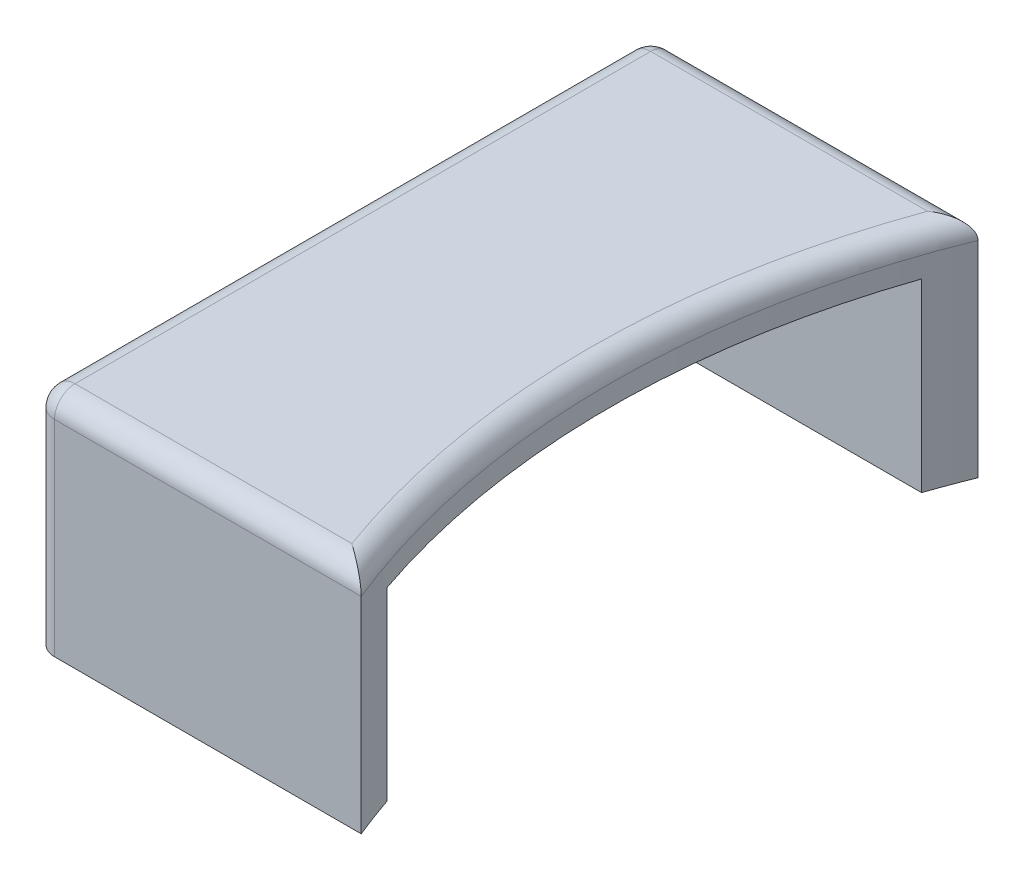
ISO-10303-21;
HEADER;
FILE_DESCRIPTION(('STEP AP214'),'2;1');
FILE_NAME('part.step','',(''),(''),'','','');
FILE_SCHEMA(('AUTOMOTIVE_DESIGN { 1 0 10303 214 1 1 1 1 }'));
ENDSEC;
DATA;
#1=APPLICATION_CONTEXT('core data for automotive mechanical design processes');
#2=APPLICATION_PROTOCOL_DEFINITION('international standard','automotive_design',2000,#1);
#3=PRODUCT_CONTEXT('',#1,'mechanical');
#4=PRODUCT('Part','Part','',(#3));
#5=PRODUCT_RELATED_PRODUCT_CATEGORY('part','',(#4));
#6=PRODUCT_DEFINITION_FORMATION('','',#4);
#7=PRODUCT_DEFINITION_CONTEXT('part definition',#1,'design');
#8=PRODUCT_DEFINITION('design','',#6,#7);
#9=PRODUCT_DEFINITION_SHAPE('','',#8);
#10=(LENGTH_UNIT() NAMED_UNIT(*) SI_UNIT(.MILLI.,.METRE.));
#11=(NAMED_UNIT(*) PLANE_ANGLE_UNIT() SI_UNIT($,.RADIAN.));
#12=(NAMED_UNIT(*) SI_UNIT($,.STERADIAN.) SOLID_ANGLE_UNIT());
#13=UNCERTAINTY_MEASURE_WITH_UNIT(LENGTH_MEASURE(1.E-05),#10,'distance_accuracy_value','');
#14=(GEOMETRIC_REPRESENTATION_CONTEXT(3) GLOBAL_UNCERTAINTY_ASSIGNED_CONTEXT((#13)) GLOBAL_UNIT_ASSIGNED_CONTEXT((#10,
#11,#12)) REPRESENTATION_CONTEXT('',''));
#15=CARTESIAN_POINT('',(0.,0.,0.));
#16=DIRECTION('',(0.,0.,1.));
#17=DIRECTION('',(1.,0.,0.));
#18=AXIS2_PLACEMENT_3D('',#15,#16,#17);
#19=CARTESIAN_POINT('',(0.,11.,0.));
#20=DIRECTION('',(0.,0.,-1.));
#21=DIRECTION('',(-1.,0.,0.));
#22=AXIS2_PLACEMENT_3D('',#19,#20,#21);
#23=PLANE('',#22);
#24=DIRECTION('',(1.,0.,0.));
#25=VECTOR('',#24,1.);
#26=CARTESIAN_POINT('',(0.,10.,0.));
#27=LINE('',#26,#25);
#28=CARTESIAN_POINT('',(15.92,10.,0.));
#29=VERTEX_POINT('',#28);
#30=CARTESIAN_POINT('',(1.,10.,0.));
#31=VERTEX_POINT('',#30);
#32=EDGE_CURVE('E193',#29,#31,#27,.F.);
#33=ORIENTED_EDGE('',*,*,#32,.T.);
#34=DIRECTION('',(0.,-1.,0.));
#35=VECTOR('',#34,1.);
#36=CARTESIAN_POINT('',(1.,11.,0.));
#37=LINE('',#36,#35);
#38=CARTESIAN_POINT('',(1.,0.,0.));
#39=VERTEX_POINT('',#38);
#40=EDGE_CURVE('E195',#31,#39,#37,.T.);
#41=ORIENTED_EDGE('',*,*,#40,.T.);
#42=DIRECTION('',(1.,0.,0.));
#43=VECTOR('',#42,1.);
#44=CARTESIAN_POINT('',(0.,0.,0.));
#45=LINE('',#44,#43);
#46=CARTESIAN_POINT('',(15.92,0.,0.));
#47=VERTEX_POINT('',#46);
#48=EDGE_CURVE('E165',#39,#47,#45,.T.);
#49=ORIENTED_EDGE('',*,*,#48,.T.);
#50=DIRECTION('',(0.,-1.,0.));
#51=VECTOR('',#50,1.);
#52=CARTESIAN_POINT('',(15.92,11.,0.));
#53=LINE('',#52,#51);
#54=EDGE_CURVE('E178',#29,#47,#53,.T.);
#55=ORIENTED_EDGE('',*,*,#54,.F.);
#56=EDGE_LOOP('',(#33,#41,#49,#55));
#57=FACE_BOUND('',#56,.T.);
#58=ADVANCED_FACE('F35',(#57),#23,.F.);
#59=CARTESIAN_POINT('',(53.,11.,-15.));
#60=DIRECTION('',(0.,-1.,0.));
#61=DIRECTION('',(0.,0.,-1.));
#62=AXIS2_PLACEMENT_3D('',#59,#60,#61);
#63=CYLINDRICAL_SURFACE('',#62,39.9990799894198);
#64=DIRECTION('',(0.,-1.,0.));
#65=VECTOR('',#64,1.);
#66=CARTESIAN_POINT('',(15.92,11.,-30.));
#67=LINE('',#66,#65);
#68=CARTESIAN_POINT('',(15.92,10.,-30.));
#69=VERTEX_POINT('',#68);
#70=CARTESIAN_POINT('',(15.92,0.,-30.));
#71=VERTEX_POINT('',#70);
#72=EDGE_CURVE('E176',#69,#71,#67,.T.);
#73=ORIENTED_EDGE('',*,*,#72,.F.);
#74=CARTESIAN_POINT('',(53.,10.,-15.));
#75=DIRECTION('',(0.,1.,0.));
#76=DIRECTION('',(0.,0.,1.));
#77=AXIS2_PLACEMENT_3D('',#74,#75,#76);
#78=CIRCLE('',#77,39.9990799894198);
#79=EDGE_CURVE('E190',#69,#29,#78,.T.);
#80=ORIENTED_EDGE('',*,*,#79,.T.);
#81=ORIENTED_EDGE('',*,*,#54,.T.);
#82=CARTESIAN_POINT('',(53.,0.,-15.));
#83=DIRECTION('',(0.,-1.,0.));
#84=DIRECTION('',(0.,0.,1.));
#85=AXIS2_PLACEMENT_3D('',#82,#83,#84);
#86=CIRCLE('',#85,39.9990799894198);
#87=CARTESIAN_POINT('',(15.1724121836985,0.,-2.));
#88=VERTEX_POINT('',#87);
#89=EDGE_CURVE('E168',#47,#88,#86,.T.);
#90=ORIENTED_EDGE('',*,*,#89,.T.);
#91=DIRECTION('',(0.,-1.,0.));
#92=VECTOR('',#91,1.);
#93=CARTESIAN_POINT('',(15.1724121836985,9.,-2.));
#94=LINE('',#93,#92);
#95=CARTESIAN_POINT('',(15.1724121836985,9.,-2.));
#96=VERTEX_POINT('',#95);
#97=EDGE_CURVE('E162',#96,#88,#94,.T.);
#98=ORIENTED_EDGE('',*,*,#97,.F.);
#99=CARTESIAN_POINT('',(53.,9.,-15.));
#100=DIRECTION('',(0.,1.,0.));
#101=DIRECTION('',(0.,0.,1.));
#102=AXIS2_PLACEMENT_3D('',#99,#100,#101);
#103=CIRCLE('',#102,39.9990799894198);
#104=CARTESIAN_POINT('',(15.1724121836985,9.,-28.));
#105=VERTEX_POINT('',#104);
#106=EDGE_CURVE('E148',#96,#105,#103,.F.);
#107=ORIENTED_EDGE('',*,*,#106,.T.);
#108=DIRECTION('',(0.,-1.,0.));
#109=VECTOR('',#108,1.);
#110=CARTESIAN_POINT('',(15.1724121836985,9.,-28.));
#111=LINE('',#110,#109);
#112=CARTESIAN_POINT('',(15.1724121836985,0.,-28.));
#113=VERTEX_POINT('',#112);
#114=EDGE_CURVE('E156',#105,#113,#111,.T.);
#115=ORIENTED_EDGE('',*,*,#114,.T.);
#116=EDGE_CURVE('E167',#113,#71,#86,.T.);
#117=ORIENTED_EDGE('',*,*,#116,.T.);
#118=EDGE_LOOP('',(#73,#80,#81,#90,#98,#107,#115,#117));
#119=FACE_BOUND('',#118,.T.);
#120=ADVANCED_FACE('F254',(#119),#63,.F.);
#121=CARTESIAN_POINT('',(15.92,11.,-30.));
#122=DIRECTION('',(0.,0.,1.));
#123=DIRECTION('',(1.,0.,0.));
#124=AXIS2_PLACEMENT_3D('',#121,#122,#123);
#125=PLANE('',#124);
#126=DIRECTION('',(-1.,0.,0.));
#127=VECTOR('',#126,1.);
#128=CARTESIAN_POINT('',(15.92,0.,-30.));
#129=LINE('',#128,#127);
#130=CARTESIAN_POINT('',(1.,0.,-30.));
#131=VERTEX_POINT('',#130);
#132=EDGE_CURVE('E171',#71,#131,#129,.T.);
#133=ORIENTED_EDGE('',*,*,#132,.T.);
#134=DIRECTION('',(0.,-1.,0.));
#135=VECTOR('',#134,1.);
#136=CARTESIAN_POINT('',(1.,11.,-30.));
#137=LINE('',#136,#135);
#138=CARTESIAN_POINT('',(1.,10.,-30.));
#139=VERTEX_POINT('',#138);
#140=EDGE_CURVE('E11',#131,#139,#137,.F.);
#141=ORIENTED_EDGE('',*,*,#140,.T.);
#142=DIRECTION('',(-1.,0.,0.));
#143=VECTOR('',#142,1.);
#144=CARTESIAN_POINT('',(15.92,10.,-30.));
#145=LINE('',#144,#143);
#146=EDGE_CURVE('E44',#139,#69,#145,.F.);
#147=ORIENTED_EDGE('',*,*,#146,.T.);
#148=ORIENTED_EDGE('',*,*,#72,.T.);
#149=EDGE_LOOP('',(#133,#141,#147,#148));
#150=FACE_BOUND('',#149,.T.);
#151=ADVANCED_FACE('F259',(#150),#125,.F.);
#152=CARTESIAN_POINT('',(0.,11.,0.));
#153=DIRECTION('',(1.,0.,0.));
#154=DIRECTION('',(0.,0.,-1.));
#155=AXIS2_PLACEMENT_3D('',#152,#153,#154);
#156=PLANE('',#155);
#157=DIRECTION('',(0.,0.,1.));
#158=VECTOR('',#157,1.);
#159=CARTESIAN_POINT('',(0.,0.,0.));
#160=LINE('',#159,#158);
#161=CARTESIAN_POINT('',(0.,0.,-29.));
#162=VERTEX_POINT('',#161);
#163=CARTESIAN_POINT('',(0.,0.,-1.));
#164=VERTEX_POINT('',#163);
#165=EDGE_CURVE('E173',#162,#164,#160,.T.);
#166=ORIENTED_EDGE('',*,*,#165,.T.);
#167=DIRECTION('',(0.,-1.,0.));
#168=VECTOR('',#167,1.);
#169=CARTESIAN_POINT('',(0.,11.,-1.));
#170=LINE('',#169,#168);
#171=CARTESIAN_POINT('',(0.,10.,-1.));
#172=VERTEX_POINT('',#171);
#173=EDGE_CURVE('E204',#164,#172,#170,.F.);
#174=ORIENTED_EDGE('',*,*,#173,.T.);
#175=DIRECTION('',(0.,0.,1.));
#176=VECTOR('',#175,1.);
#177=CARTESIAN_POINT('',(0.,10.,-30.));
#178=LINE('',#177,#176);
#179=CARTESIAN_POINT('',(0.,10.,-29.));
#180=VERTEX_POINT('',#179);
#181=EDGE_CURVE('E58',#172,#180,#178,.F.);
#182=ORIENTED_EDGE('',*,*,#181,.T.);
#183=DIRECTION('',(0.,-1.,0.));
#184=VECTOR('',#183,1.);
#185=CARTESIAN_POINT('',(0.,11.,-29.));
#186=LINE('',#185,#184);
#187=EDGE_CURVE('E202',#180,#162,#186,.T.);
#188=ORIENTED_EDGE('',*,*,#187,.T.);
#189=EDGE_LOOP('',(#166,#174,#182,#188));
#190=FACE_BOUND('',#189,.T.);
#191=ADVANCED_FACE('F265',(#190),#156,.F.);
#192=CARTESIAN_POINT('',(53.,11.,-15.));
#193=DIRECTION('',(0.,1.,0.));
#194=DIRECTION('',(0.,0.,1.));
#195=AXIS2_PLACEMENT_3D('',#192,#193,#194);
#196=PLANE('',#195);
#197=DIRECTION('',(0.,0.,1.));
#198=VECTOR('',#197,1.);
#199=CARTESIAN_POINT('',(1.,11.,0.));
#200=LINE('',#199,#198);
#201=CARTESIAN_POINT('',(1.,11.,-29.));
#202=VERTEX_POINT('',#201);
#203=CARTESIAN_POINT('',(1.,11.,-1.));
#204=VERTEX_POINT('',#203);
#205=EDGE_CURVE('E183',#202,#204,#200,.T.);
#206=ORIENTED_EDGE('',*,*,#205,.T.);
#207=DIRECTION('',(1.,0.,0.));
#208=VECTOR('',#207,1.);
#209=CARTESIAN_POINT('',(15.92,11.,-1.));
#210=LINE('',#209,#208);
#211=CARTESIAN_POINT('',(14.4652811093835,11.,-1.));
#212=VERTEX_POINT('',#211);
#213=EDGE_CURVE('E188',#204,#212,#210,.T.);
#214=ORIENTED_EDGE('',*,*,#213,.T.);
#215=CARTESIAN_POINT('',(53.,11.,-15.));
#216=DIRECTION('',(0.,1.,0.));
#217=DIRECTION('',(0.,0.,1.));
#218=AXIS2_PLACEMENT_3D('',#215,#216,#217);
#219=CIRCLE('',#218,40.9990799894198);
#220=CARTESIAN_POINT('',(14.4652811093835,11.,-29.));
#221=VERTEX_POINT('',#220);
#222=EDGE_CURVE('E185',#212,#221,#219,.F.);
#223=ORIENTED_EDGE('',*,*,#222,.T.);
#224=DIRECTION('',(-1.,0.,0.));
#225=VECTOR('',#224,1.);
#226=CARTESIAN_POINT('',(0.,11.,-29.));
#227=LINE('',#226,#225);
#228=EDGE_CURVE('E181',#221,#202,#227,.T.);
#229=ORIENTED_EDGE('',*,*,#228,.T.);
#230=EDGE_LOOP('',(#206,#214,#223,#229));
#231=FACE_BOUND('',#230,.T.);
#232=ADVANCED_FACE('F268',(#231),#196,.T.);
#233=CARTESIAN_POINT('',(53.,0.,-15.));
#234=DIRECTION('',(0.,1.,0.));
#235=DIRECTION('',(0.,0.,1.));
#236=AXIS2_PLACEMENT_3D('',#233,#234,#235);
#237=PLANE('',#236);
#238=ORIENTED_EDGE('',*,*,#48,.F.);
#239=CARTESIAN_POINT('',(1.,0.,-1.));
#240=DIRECTION('',(0.,1.,0.));
#241=DIRECTION('',(0.,0.,1.));
#242=AXIS2_PLACEMENT_3D('',#239,#240,#241);
#243=CIRCLE('',#242,1.);
#244=EDGE_CURVE('E199',#39,#164,#243,.F.);
#245=ORIENTED_EDGE('',*,*,#244,.T.);
#246=ORIENTED_EDGE('',*,*,#165,.F.);
#247=CARTESIAN_POINT('',(1.,0.,-29.));
#248=DIRECTION('',(0.,1.,0.));
#249=DIRECTION('',(0.,0.,1.));
#250=AXIS2_PLACEMENT_3D('',#247,#248,#249);
#251=CIRCLE('',#250,1.);
#252=EDGE_CURVE('E197',#162,#131,#251,.F.);
#253=ORIENTED_EDGE('',*,*,#252,.T.);
#254=ORIENTED_EDGE('',*,*,#132,.F.);
#255=ORIENTED_EDGE('',*,*,#116,.F.);
#256=DIRECTION('',(-1.,0.,0.));
#257=VECTOR('',#256,1.);
#258=CARTESIAN_POINT('',(15.92,0.,-28.));
#259=LINE('',#258,#257);
#260=CARTESIAN_POINT('',(2.,0.,-28.));
#261=VERTEX_POINT('',#260);
#262=EDGE_CURVE('E152',#113,#261,#259,.T.);
#263=ORIENTED_EDGE('',*,*,#262,.T.);
#264=DIRECTION('',(0.,0.,1.));
#265=VECTOR('',#264,1.);
#266=CARTESIAN_POINT('',(2.,0.,0.));
#267=LINE('',#266,#265);
#268=CARTESIAN_POINT('',(2.,0.,-2.));
#269=VERTEX_POINT('',#268);
#270=EDGE_CURVE('E149',#261,#269,#267,.T.);
#271=ORIENTED_EDGE('',*,*,#270,.T.);
#272=DIRECTION('',(1.,0.,0.));
#273=VECTOR('',#272,1.);
#274=CARTESIAN_POINT('',(0.,0.,-2.));
#275=LINE('',#274,#273);
#276=EDGE_CURVE('E143',#269,#88,#275,.T.);
#277=ORIENTED_EDGE('',*,*,#276,.T.);
#278=ORIENTED_EDGE('',*,*,#89,.F.);
#279=EDGE_LOOP('',(#238,#245,#246,#253,#254,#255,#263,#271,#277,#278));
#280=FACE_BOUND('',#279,.T.);
#281=ADVANCED_FACE('F269',(#280),#237,.F.);
#282=CARTESIAN_POINT('',(0.,11.,-2.));
#283=DIRECTION('',(0.,0.,-1.));
#284=DIRECTION('',(-1.,0.,0.));
#285=AXIS2_PLACEMENT_3D('',#282,#283,#284);
#286=PLANE('',#285);
#287=ORIENTED_EDGE('',*,*,#276,.F.);
#288=DIRECTION('',(0.,-1.,0.));
#289=VECTOR('',#288,1.);
#290=CARTESIAN_POINT('',(2.,11.,-2.));
#291=LINE('',#290,#289);
#292=CARTESIAN_POINT('',(2.,9.,-2.));
#293=VERTEX_POINT('',#292);
#294=EDGE_CURVE('E128',#293,#269,#291,.T.);
#295=ORIENTED_EDGE('',*,*,#294,.F.);
#296=DIRECTION('',(1.,0.,0.));
#297=VECTOR('',#296,1.);
#298=CARTESIAN_POINT('',(0.,9.,-2.));
#299=LINE('',#298,#297);
#300=EDGE_CURVE('E140',#293,#96,#299,.T.);
#301=ORIENTED_EDGE('',*,*,#300,.T.);
#302=ORIENTED_EDGE('',*,*,#97,.T.);
#303=EDGE_LOOP('',(#287,#295,#301,#302));
#304=FACE_BOUND('',#303,.T.);
#305=ADVANCED_FACE('F139',(#304),#286,.T.);
#306=CARTESIAN_POINT('',(15.92,11.,-28.));
#307=DIRECTION('',(0.,0.,1.));
#308=DIRECTION('',(1.,0.,0.));
#309=AXIS2_PLACEMENT_3D('',#306,#307,#308);
#310=PLANE('',#309);
#311=ORIENTED_EDGE('',*,*,#262,.F.);
#312=ORIENTED_EDGE('',*,*,#114,.F.);
#313=DIRECTION('',(-1.,0.,0.));
#314=VECTOR('',#313,1.);
#315=CARTESIAN_POINT('',(15.92,9.,-28.));
#316=LINE('',#315,#314);
#317=CARTESIAN_POINT('',(2.,9.,-28.));
#318=VERTEX_POINT('',#317);
#319=EDGE_CURVE('E135',#105,#318,#316,.T.);
#320=ORIENTED_EDGE('',*,*,#319,.T.);
#321=DIRECTION('',(0.,-1.,0.));
#322=VECTOR('',#321,1.);
#323=CARTESIAN_POINT('',(2.,11.,-28.));
#324=LINE('',#323,#322);
#325=EDGE_CURVE('E131',#318,#261,#324,.T.);
#326=ORIENTED_EDGE('',*,*,#325,.T.);
#327=EDGE_LOOP('',(#311,#312,#320,#326));
#328=FACE_BOUND('',#327,.T.);
#329=ADVANCED_FACE('F280',(#328),#310,.T.);
#330=CARTESIAN_POINT('',(2.,11.,0.));
#331=DIRECTION('',(1.,0.,0.));
#332=DIRECTION('',(0.,0.,-1.));
#333=AXIS2_PLACEMENT_3D('',#330,#331,#332);
#334=PLANE('',#333);
#335=ORIENTED_EDGE('',*,*,#270,.F.);
#336=ORIENTED_EDGE('',*,*,#325,.F.);
#337=DIRECTION('',(0.,0.,1.));
#338=VECTOR('',#337,1.);
#339=CARTESIAN_POINT('',(2.,9.,0.));
#340=LINE('',#339,#338);
#341=EDGE_CURVE('E125',#318,#293,#340,.T.);
#342=ORIENTED_EDGE('',*,*,#341,.T.);
#343=ORIENTED_EDGE('',*,*,#294,.T.);
#344=EDGE_LOOP('',(#335,#336,#342,#343));
#345=FACE_BOUND('',#344,.T.);
#346=ADVANCED_FACE('F127',(#345),#334,.T.);
#347=CARTESIAN_POINT('',(53.,9.,-15.));
#348=DIRECTION('',(0.,1.,0.));
#349=DIRECTION('',(0.,0.,1.));
#350=AXIS2_PLACEMENT_3D('',#347,#348,#349);
#351=PLANE('',#350);
#352=ORIENTED_EDGE('',*,*,#300,.F.);
#353=ORIENTED_EDGE('',*,*,#341,.F.);
#354=ORIENTED_EDGE('',*,*,#319,.F.);
#355=ORIENTED_EDGE('',*,*,#106,.F.);
#356=EDGE_LOOP('',(#352,#353,#354,#355));
#357=FACE_BOUND('',#356,.T.);
#358=ADVANCED_FACE('F146',(#357),#351,.F.);
#359=CARTESIAN_POINT('',(1.,11.,-1.));
#360=DIRECTION('',(0.,-1.,0.));
#361=DIRECTION('',(0.,0.,-1.));
#362=AXIS2_PLACEMENT_3D('',#359,#360,#361);
#363=CYLINDRICAL_SURFACE('',#362,1.);
#364=ORIENTED_EDGE('',*,*,#244,.F.);
#365=ORIENTED_EDGE('',*,*,#40,.F.);
#366=CARTESIAN_POINT('',(1.,10.,-1.));
#367=DIRECTION('',(0.,1.,0.));
#368=DIRECTION('',(0.,0.,1.));
#369=AXIS2_PLACEMENT_3D('',#366,#367,#368);
#370=CIRCLE('',#369,1.);
#371=EDGE_CURVE('E39',#172,#31,#370,.T.);
#372=ORIENTED_EDGE('',*,*,#371,.F.);
#373=ORIENTED_EDGE('',*,*,#173,.F.);
#374=EDGE_LOOP('',(#364,#365,#372,#373));
#375=FACE_BOUND('',#374,.T.);
#376=ADVANCED_FACE('F37',(#375),#363,.T.);
#377=CARTESIAN_POINT('',(1.,10.,-15.));
#378=DIRECTION('',(0.,0.,-1.));
#379=DIRECTION('',(-1.,0.,0.));
#380=AXIS2_PLACEMENT_3D('',#377,#378,#379);
#381=CYLINDRICAL_SURFACE('',#380,1.);
#382=CARTESIAN_POINT('',(1.,10.,-29.));
#383=DIRECTION('',(0.,0.,-1.));
#384=DIRECTION('',(-1.,0.,0.));
#385=AXIS2_PLACEMENT_3D('',#382,#383,#384);
#386=CIRCLE('',#385,1.);
#387=EDGE_CURVE('E380',#180,#202,#386,.T.);
#388=ORIENTED_EDGE('',*,*,#387,.F.);
#389=ORIENTED_EDGE('',*,*,#181,.F.);
#390=CARTESIAN_POINT('',(1.,10.,-1.));
#391=DIRECTION('',(0.,0.,1.));
#392=DIRECTION('',(1.,0.,0.));
#393=AXIS2_PLACEMENT_3D('',#390,#391,#392);
#394=CIRCLE('',#393,1.);
#395=EDGE_CURVE('E378',#204,#172,#394,.T.);
#396=ORIENTED_EDGE('',*,*,#395,.F.);
#397=ORIENTED_EDGE('',*,*,#205,.F.);
#398=EDGE_LOOP('',(#388,#389,#396,#397));
#399=FACE_BOUND('',#398,.T.);
#400=ADVANCED_FACE('F244',(#399),#381,.T.);
#401=CARTESIAN_POINT('',(1.,11.,-29.));
#402=DIRECTION('',(0.,-1.,0.));
#403=DIRECTION('',(0.,0.,-1.));
#404=AXIS2_PLACEMENT_3D('',#401,#402,#403);
#405=CYLINDRICAL_SURFACE('',#404,1.);
#406=ORIENTED_EDGE('',*,*,#252,.F.);
#407=ORIENTED_EDGE('',*,*,#187,.F.);
#408=CARTESIAN_POINT('',(1.,10.,-29.));
#409=DIRECTION('',(0.,1.,0.));
#410=DIRECTION('',(0.,0.,1.));
#411=AXIS2_PLACEMENT_3D('',#408,#409,#410);
#412=CIRCLE('',#411,1.);
#413=EDGE_CURVE('E384',#139,#180,#412,.T.);
#414=ORIENTED_EDGE('',*,*,#413,.F.);
#415=ORIENTED_EDGE('',*,*,#140,.F.);
#416=EDGE_LOOP('',(#406,#407,#414,#415));
#417=FACE_BOUND('',#416,.T.);
#418=ADVANCED_FACE('F241',(#417),#405,.T.);
#419=CARTESIAN_POINT('',(1.,10.,-1.));
#420=DIRECTION('',(0.,0.,1.));
#421=DIRECTION('',(1.,0.,0.));
#422=AXIS2_PLACEMENT_3D('',#419,#420,#421);
#423=SPHERICAL_SURFACE('',#422,1.);
#424=ORIENTED_EDGE('',*,*,#395,.T.);
#425=ORIENTED_EDGE('',*,*,#371,.T.);
#426=CARTESIAN_POINT('',(1.,10.,-1.));
#427=DIRECTION('',(-1.,0.,0.));
#428=DIRECTION('',(0.,-1.,0.));
#429=AXIS2_PLACEMENT_3D('',#426,#427,#428);
#430=CIRCLE('',#429,1.);
#431=EDGE_CURVE('E363',#204,#31,#430,.F.);
#432=ORIENTED_EDGE('',*,*,#431,.F.);
#433=EDGE_LOOP('',(#424,#425,#432));
#434=FACE_BOUND('',#433,.T.);
#435=ADVANCED_FACE('F237',(#434),#423,.T.);
#436=CARTESIAN_POINT('',(1.,10.,-29.));
#437=DIRECTION('',(0.,0.,1.));
#438=DIRECTION('',(1.,0.,0.));
#439=AXIS2_PLACEMENT_3D('',#436,#437,#438);
#440=SPHERICAL_SURFACE('',#439,1.);
#441=ORIENTED_EDGE('',*,*,#413,.T.);
#442=ORIENTED_EDGE('',*,*,#387,.T.);
#443=CARTESIAN_POINT('',(1.,10.,-29.));
#444=DIRECTION('',(-1.,0.,0.));
#445=DIRECTION('',(0.,0.,1.));
#446=AXIS2_PLACEMENT_3D('',#443,#444,#445);
#447=CIRCLE('',#446,1.);
#448=EDGE_CURVE('E360',#139,#202,#447,.F.);
#449=ORIENTED_EDGE('',*,*,#448,.F.);
#450=EDGE_LOOP('',(#441,#442,#449));
#451=FACE_BOUND('',#450,.T.);
#452=ADVANCED_FACE('F233',(#451),#440,.T.);
#453=CARTESIAN_POINT('',(53.,10.,-1.));
#454=DIRECTION('',(-1.,0.,0.));
#455=DIRECTION('',(0.,0.,1.));
#456=AXIS2_PLACEMENT_3D('',#453,#454,#455);
#457=CYLINDRICAL_SURFACE('',#456,1.);
#458=ORIENTED_EDGE('',*,*,#431,.T.);
#459=ORIENTED_EDGE('',*,*,#32,.F.);
#460=CARTESIAN_POINT('',(15.92,10.,0.));
#461=CARTESIAN_POINT('',(15.9200646069726,10.0335081397669,4.29914407504274E-05));
#462=CARTESIAN_POINT('',(15.9175052883939,10.0669205481949,-0.00168189791521517));
#463=CARTESIAN_POINT('',(15.9077258339132,10.1324125355022,-0.00827616941481642));
#464=CARTESIAN_POINT('',(15.9005517632109,10.1645019877873,-0.0131144731294718));
#465=CARTESIAN_POINT('',(15.8801076087916,10.2336707493763,-0.0269085694607031));
#466=CARTESIAN_POINT('',(15.8658521722917,10.2703207846063,-0.0365302547927677));
#467=CARTESIAN_POINT('',(15.8325834844924,10.3404203322686,-0.0590025424670404));
#468=CARTESIAN_POINT('',(15.8135513176705,10.3738563716552,-0.0718659827877851));
#469=CARTESIAN_POINT('',(15.7619335298439,10.4525653807831,-0.106785924472365));
#470=CARTESIAN_POINT('',(15.7272325943834,10.4957935721227,-0.130287791132514));
#471=CARTESIAN_POINT('',(15.6528677307928,10.575353180428,-0.180734808979692));
#472=CARTESIAN_POINT('',(15.6131943825513,10.6116711683174,-0.207686497886743));
#473=CARTESIAN_POINT('',(15.5370589282194,10.6730565182701,-0.259498311979782));
#474=CARTESIAN_POINT('',(15.5010620674546,10.6989951369659,-0.284028336543046));
#475=CARTESIAN_POINT('',(15.4273864441761,10.7470380944762,-0.33431038332435));
#476=CARTESIAN_POINT('',(15.3897065379142,10.7691397744012,-0.360063237314368));
#477=CARTESIAN_POINT('',(15.2747298608286,10.8303346626174,-0.438768752803183));
#478=CARTESIAN_POINT('',(15.1955907133394,10.8642457582849,-0.493104049564251));
#479=CARTESIAN_POINT('',(15.0627312770501,10.9105448307624,-0.584620502217234));
#480=CARTESIAN_POINT('',(15.009712421445,10.9263186237875,-0.621216763987075));
#481=CARTESIAN_POINT('',(14.9029359935649,10.9531876516012,-0.69507557794212));
#482=CARTESIAN_POINT('',(14.8491781497778,10.9642811166294,-0.732338376621502));
#483=CARTESIAN_POINT('',(14.6875163419775,10.990847234609,-0.844636388027749));
#484=CARTESIAN_POINT('',(14.5789121945698,10.9997099205228,-0.920396003823847));
#485=CARTESIAN_POINT('',(14.4688429511283,10.9999976500041,-0.997504506354331));
#486=CARTESIAN_POINT('',(14.4670619847367,10.9999999848993,-0.998752241419807));
#487=CARTESIAN_POINT('',(14.4652811093835,11.,-1.));
#488=B_SPLINE_CURVE_WITH_KNOTS('',3,(#460,#461,#462,#463,#464,#465,#466,#467,#468,#469,#470,
#471,#472,#473,#474,#475,#476,#477,#478,#479,#480,#481,#482,#483,#484,#485,#486,#487),
.UNSPECIFIED.,.F.,.F.,(4,2,2,2,2,2,2,2,2,2,2,2,2,4),(0.,0.100227381763195,0.199469484508997,
0.320258366108278,0.441533325790706,0.621156729097719,0.801125719220237,0.953005641864319,
1.10499039646826,1.4093609662948,1.60819018847507,1.80709452620241,2.20373382313406,
2.2102574814218),.UNSPECIFIED.);
#489=EDGE_CURVE('E215',#212,#29,#488,.F.);
#490=ORIENTED_EDGE('',*,*,#489,.F.);
#491=ORIENTED_EDGE('',*,*,#213,.F.);
#492=EDGE_LOOP('',(#458,#459,#490,#491));
#493=FACE_BOUND('',#492,.T.);
#494=ADVANCED_FACE('F228',(#493),#457,.T.);
#495=CARTESIAN_POINT('',(53.,10.,-29.));
#496=DIRECTION('',(1.,0.,0.));
#497=DIRECTION('',(0.,0.,-1.));
#498=AXIS2_PLACEMENT_3D('',#495,#496,#497);
#499=CYLINDRICAL_SURFACE('',#498,1.);
#500=ORIENTED_EDGE('',*,*,#448,.T.);
#501=ORIENTED_EDGE('',*,*,#228,.F.);
#502=CARTESIAN_POINT('',(15.92,10.,-30.));
#503=CARTESIAN_POINT('',(15.9200646069726,10.0335081397669,-30.0000429914408));
#504=CARTESIAN_POINT('',(15.917505288394,10.0669205481949,-29.9983181020848));
#505=CARTESIAN_POINT('',(15.9077258339132,10.1324125355022,-29.9917238305852));
#506=CARTESIAN_POINT('',(15.9005517632109,10.1645019877873,-29.9868855268705));
#507=CARTESIAN_POINT('',(15.8801076087916,10.2336707493763,-29.9730914305393));
#508=CARTESIAN_POINT('',(15.8658521722917,10.2703207846063,-29.9634697452072));
#509=CARTESIAN_POINT('',(15.8325834844924,10.3404203322686,-29.940997457533));
#510=CARTESIAN_POINT('',(15.8135513176705,10.3738563716552,-29.9281340172122));
#511=CARTESIAN_POINT('',(15.7619335298439,10.4525653807831,-29.8932140755276));
#512=CARTESIAN_POINT('',(15.7272325943834,10.4957935721227,-29.8697122088675));
#513=CARTESIAN_POINT('',(15.6528677307928,10.575353180428,-29.8192651910203));
#514=CARTESIAN_POINT('',(15.6131943825513,10.6116711683174,-29.7923135021133));
#515=CARTESIAN_POINT('',(15.5370589282194,10.6730565182701,-29.7405016880202));
#516=CARTESIAN_POINT('',(15.5010620674546,10.6989951369659,-29.715971663457));
#517=CARTESIAN_POINT('',(15.4273864441761,10.7470380944762,-29.6656896166756));
#518=CARTESIAN_POINT('',(15.3897065379142,10.7691397744012,-29.6399367626856));
#519=CARTESIAN_POINT('',(15.2747298608286,10.8303346626174,-29.5612312471968));
#520=CARTESIAN_POINT('',(15.1955907133394,10.8642457582849,-29.5068959504357));
#521=CARTESIAN_POINT('',(15.0627312770501,10.9105448307624,-29.4153794977828));
#522=CARTESIAN_POINT('',(15.009712421445,10.9263186237875,-29.3787832360129));
#523=CARTESIAN_POINT('',(14.9029359935649,10.9531876516012,-29.3049244220579));
#524=CARTESIAN_POINT('',(14.8491781497779,10.9642811166294,-29.2676616233784));
#525=CARTESIAN_POINT('',(14.6875163419774,10.9908472346091,-29.1553636119723));
#526=CARTESIAN_POINT('',(14.5789121945694,10.9997099205228,-29.0796039961767));
#527=CARTESIAN_POINT('',(14.4688429511282,10.9999976500041,-29.0024954936457));
#528=CARTESIAN_POINT('',(14.4670619847367,10.9999999848993,-29.0012477585802));
#529=CARTESIAN_POINT('',(14.4652811093835,11.,-29.));
#530=B_SPLINE_CURVE_WITH_KNOTS('',3,(#502,#503,#504,#505,#506,#507,#508,#509,#510,#511,#512,
#513,#514,#515,#516,#517,#518,#519,#520,#521,#522,#523,#524,#525,#526,#527,#528,#529),
.UNSPECIFIED.,.F.,.F.,(4,2,2,2,2,2,2,2,2,2,2,2,2,4),(0.,0.100227381763195,0.199469484509001,
0.320258366108277,0.441533325790707,0.621156729097723,0.801125719220241,0.953005641864321,
1.10499039646827,1.40936096629481,1.60819018847508,1.80709452620242,2.20373382313407,
2.21025748142181),.UNSPECIFIED.);
#531=EDGE_CURVE('E207',#69,#221,#530,.T.);
#532=ORIENTED_EDGE('',*,*,#531,.F.);
#533=ORIENTED_EDGE('',*,*,#146,.F.);
#534=EDGE_LOOP('',(#500,#501,#532,#533));
#535=FACE_BOUND('',#534,.T.);
#536=ADVANCED_FACE('F225',(#535),#499,.T.);
#537=CARTESIAN_POINT('',(53.,10.,-15.));
#538=DIRECTION('',(0.,1.,0.));
#539=DIRECTION('',(0.,0.,1.));
#540=AXIS2_PLACEMENT_3D('',#537,#538,#539);
#541=TOROIDAL_SURFACE('',#540,40.9990799894198,1.);
#542=ORIENTED_EDGE('',*,*,#489,.T.);
#543=ORIENTED_EDGE('',*,*,#79,.F.);
#544=ORIENTED_EDGE('',*,*,#531,.T.);
#545=ORIENTED_EDGE('',*,*,#222,.F.);
#546=EDGE_LOOP('',(#542,#543,#544,#545));
#547=FACE_BOUND('',#546,.T.);
#548=ADVANCED_FACE('F222',(#547),#541,.T.);
#549=CLOSED_SHELL('',(#58,#120,#151,#191,#232,#281,#305,#329,#346,#358,#376,#400,#418,#435,#452,
#494,#536,#548));
#550=MANIFOLD_SOLID_BREP('B2',#549);
#551=ADVANCED_BREP_SHAPE_REPRESENTATION('',(#18,#550),#14);
#552=SHAPE_DEFINITION_REPRESENTATION(#9,#551);
ENDSEC;
END-ISO-10303-21;
